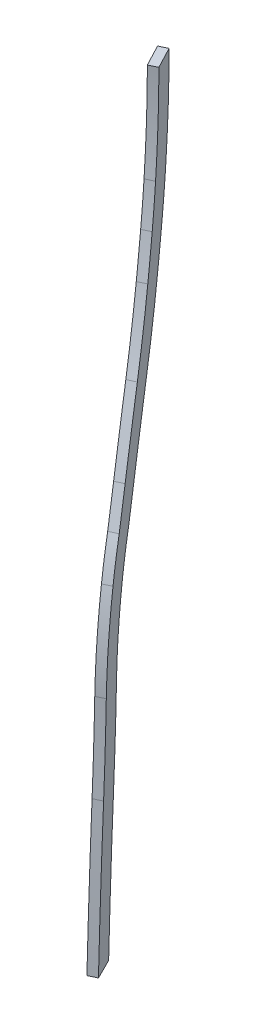
ISO-10303-21;
HEADER;
FILE_DESCRIPTION(('STEP AP214'),'2;1');
FILE_NAME('part.step','',(''),(''),'','','');
FILE_SCHEMA(('AUTOMOTIVE_DESIGN { 1 0 10303 214 1 1 1 1 }'));
ENDSEC;
DATA;
#1=APPLICATION_CONTEXT('core data for automotive mechanical design processes');
#2=APPLICATION_PROTOCOL_DEFINITION('international standard','automotive_design',2000,#1);
#3=PRODUCT_CONTEXT('',#1,'mechanical');
#4=PRODUCT('Part','Part','',(#3));
#5=PRODUCT_RELATED_PRODUCT_CATEGORY('part','',(#4));
#6=PRODUCT_DEFINITION_FORMATION('','',#4);
#7=PRODUCT_DEFINITION_CONTEXT('part definition',#1,'design');
#8=PRODUCT_DEFINITION('design','',#6,#7);
#9=PRODUCT_DEFINITION_SHAPE('','',#8);
#10=(LENGTH_UNIT() NAMED_UNIT(*) SI_UNIT(.MILLI.,.METRE.));
#11=(NAMED_UNIT(*) PLANE_ANGLE_UNIT() SI_UNIT($,.RADIAN.));
#12=(NAMED_UNIT(*) SI_UNIT($,.STERADIAN.) SOLID_ANGLE_UNIT());
#13=UNCERTAINTY_MEASURE_WITH_UNIT(LENGTH_MEASURE(1.E-05),#10,'distance_accuracy_value','');
#14=(GEOMETRIC_REPRESENTATION_CONTEXT(3) GLOBAL_UNCERTAINTY_ASSIGNED_CONTEXT((#13)) GLOBAL_UNIT_ASSIGNED_CONTEXT((#10,
#11,#12)) REPRESENTATION_CONTEXT('',''));
#15=CARTESIAN_POINT('',(0.,0.,0.));
#16=DIRECTION('',(0.,0.,1.));
#17=DIRECTION('',(1.,0.,0.));
#18=AXIS2_PLACEMENT_3D('',#15,#16,#17);
#19=CARTESIAN_POINT('',(-367.259245898407,666.87762557085,512.145917149951));
#20=DIRECTION('',(0.00922442193968946,0.999819165978723,-0.0166296536791849));
#21=DIRECTION('',(0.448846174599476,0.0107209315099118,0.893544723656839));
#22=AXIS2_PLACEMENT_3D('',#19,#20,#21);
#23=PLANE('',#22);
#24=DIRECTION('',(-0.448846174599474,-0.0107209315099118,-0.89354472365684));
#25=VECTOR('',#24,1.);
#26=CARTESIAN_POINT('',(-380.662667284647,667.113224420727,518.875908853125));
#27=LINE('',#26,#25);
#28=CARTESIAN_POINT('',(-380.662667284647,667.113224420725,518.875908853126));
#29=VERTEX_POINT('',#28);
#30=CARTESIAN_POINT('',(-398.616514268626,666.68438716033,483.134119906853));
#31=VERTEX_POINT('',#30);
#32=EDGE_CURVE('E169',#29,#31,#27,.T.);
#33=ORIENTED_EDGE('',*,*,#32,.T.);
#34=DIRECTION('',(-0.893561425749398,0.0157065899918101,0.448666113544954));
#35=VECTOR('',#34,1.);
#36=CARTESIAN_POINT('',(-385.213092882385,666.448788310454,476.404128203679));
#37=LINE('',#36,#35);
#38=CARTESIAN_POINT('',(-385.213092882385,666.448788310454,476.404128203679));
#39=VERTEX_POINT('',#38);
#40=EDGE_CURVE('E11',#39,#31,#37,.T.);
#41=ORIENTED_EDGE('',*,*,#40,.F.);
#42=DIRECTION('',(-0.448846174599474,-0.0107209315099118,-0.89354472365684));
#43=VECTOR('',#42,1.);
#44=CARTESIAN_POINT('',(-367.259245898407,666.87762557085,512.145917149951));
#45=LINE('',#44,#43);
#46=CARTESIAN_POINT('',(-367.259245898406,666.877625570848,512.145917149952));
#47=VERTEX_POINT('',#46);
#48=EDGE_CURVE('E190',#47,#39,#45,.T.);
#49=ORIENTED_EDGE('',*,*,#48,.F.);
#50=DIRECTION('',(-0.893561425749398,0.0157065899918101,0.448666113544954));
#51=VECTOR('',#50,1.);
#52=CARTESIAN_POINT('',(-367.259245898406,666.877625570848,512.145917149952));
#53=LINE('',#52,#51);
#54=EDGE_CURVE('E182',#47,#29,#53,.T.);
#55=ORIENTED_EDGE('',*,*,#54,.T.);
#56=EDGE_LOOP('',(#33,#41,#49,#55));
#57=FACE_BOUND('',#56,.T.);
#58=ADVANCED_FACE('F17',(#57),#23,.F.);
#59=CARTESIAN_POINT('',(-3526.45287345219,591.418592111018,-5777.04836957863));
#60=DIRECTION('',(-0.893561425749398,0.0157065899918101,0.448666113544954));
#61=DIRECTION('',(0.448846174599475,0.010720931509869,0.89354472365684));
#62=AXIS2_PLACEMENT_3D('',#59,#60,#61);
#63=CYLINDRICAL_SURFACE('',#62,6998.47733663514);
#64=CARTESIAN_POINT('',(-3539.85629483843,591.654190960895,-5770.31837787545));
#65=DIRECTION('',(-0.893561425749398,0.0157065899918101,0.448666113544954));
#66=DIRECTION('',(0.448846174599475,0.010720931509869,0.89354472365684));
#67=AXIS2_PLACEMENT_3D('',#64,#65,#66);
#68=CIRCLE('',#67,6998.47733663514);
#69=CARTESIAN_POINT('',(-398.399495897503,928.29078493591,474.408198635358));
#70=VERTEX_POINT('',#69);
#71=EDGE_CURVE('E165',#31,#70,#68,.T.);
#72=ORIENTED_EDGE('',*,*,#71,.T.);
#73=DIRECTION('',(-0.893561425749398,0.0157065899918101,0.448666113544954));
#74=VECTOR('',#73,1.);
#75=CARTESIAN_POINT('',(-384.996074511261,928.055186086033,467.678206932184));
#76=LINE('',#75,#74);
#77=CARTESIAN_POINT('',(-384.996074511261,928.055186086033,467.678206932184));
#78=VERTEX_POINT('',#77);
#79=EDGE_CURVE('E24',#78,#70,#76,.T.);
#80=ORIENTED_EDGE('',*,*,#79,.F.);
#81=CARTESIAN_POINT('',(-3526.45287345219,591.418592111018,-5777.04836957863));
#82=DIRECTION('',(-0.893561425749398,0.0157065899918101,0.448666113544954));
#83=DIRECTION('',(0.448846174599475,0.010720931509869,0.89354472365684));
#84=AXIS2_PLACEMENT_3D('',#81,#82,#83);
#85=CIRCLE('',#84,6998.47733663514);
#86=EDGE_CURVE('E178',#39,#78,#85,.T.);
#87=ORIENTED_EDGE('',*,*,#86,.F.);
#88=ORIENTED_EDGE('',*,*,#40,.T.);
#89=EDGE_LOOP('',(#72,#80,#87,#88));
#90=FACE_BOUND('',#89,.T.);
#91=ADVANCED_FACE('F177',(#90),#63,.F.);
#92=CARTESIAN_POINT('',(930.972336864513,1069.07355817785,3083.61833863724));
#93=DIRECTION('',(-0.893561425749398,0.0157065899918101,0.448666113544954));
#94=DIRECTION('',(0.448846174599475,0.010720931509869,0.89354472365684));
#95=AXIS2_PLACEMENT_3D('',#92,#93,#94);
#96=CYLINDRICAL_SURFACE('',#95,2931.68924234329);
#97=CARTESIAN_POINT('',(917.568915478271,1069.30915702773,3090.34833034041));
#98=DIRECTION('',(0.893561425749403,-0.0157065899918102,-0.448666113544943));
#99=DIRECTION('',(-0.448877183969173,-0.048101405174588,-0.892297892260279));
#100=AXIS2_PLACEMENT_3D('',#97,#98,#99);
#101=CIRCLE('',#100,2931.68924234329);
#102=CARTESIAN_POINT('',(-397.730767516883,1083.35071445715,470.311805356618));
#103=VERTEX_POINT('',#102);
#104=EDGE_CURVE('E171',#70,#103,#101,.T.);
#105=ORIENTED_EDGE('',*,*,#104,.T.);
#106=DIRECTION('',(-0.893561425749398,0.0157065899918101,0.448666113544954));
#107=VECTOR('',#106,1.);
#108=CARTESIAN_POINT('',(-384.327346130642,1083.11511560727,463.581813653444));
#109=LINE('',#108,#107);
#110=CARTESIAN_POINT('',(-384.327346130642,1083.11511560727,463.581813653444));
#111=VERTEX_POINT('',#110);
#112=EDGE_CURVE('E284',#111,#103,#109,.T.);
#113=ORIENTED_EDGE('',*,*,#112,.F.);
#114=CARTESIAN_POINT('',(930.972336864513,1069.07355817785,3083.61833863724));
#115=DIRECTION('',(0.893561425749403,-0.0157065899918102,-0.448666113544943));
#116=DIRECTION('',(-0.448877183969173,-0.048101405174588,-0.892297892260279));
#117=AXIS2_PLACEMENT_3D('',#114,#115,#116);
#118=CIRCLE('',#117,2931.68924234329);
#119=EDGE_CURVE('E189',#78,#111,#118,.T.);
#120=ORIENTED_EDGE('',*,*,#119,.F.);
#121=ORIENTED_EDGE('',*,*,#79,.T.);
#122=EDGE_LOOP('',(#105,#113,#120,#121));
#123=FACE_BOUND('',#122,.T.);
#124=ADVANCED_FACE('F288',(#123),#96,.T.);
#125=CARTESIAN_POINT('',(-656.514394695884,1086.02086410199,-78.6064177346578));
#126=DIRECTION('',(-0.893561425749398,0.0157065899918101,0.448666113544954));
#127=DIRECTION('',(0.448846174599475,0.010720931509869,0.89354472365684));
#128=AXIS2_PLACEMENT_3D('',#125,#126,#127);
#129=CYLINDRICAL_SURFACE('',#128,606.681391701386);
#130=CARTESIAN_POINT('',(-669.917816082124,1086.25646295186,-71.8764260314834));
#131=DIRECTION('',(-0.893561425749403,0.0157065899918104,0.448666113544942));
#132=DIRECTION('',(0.448649080536188,-0.00478957906813354,0.893695173124697));
#133=AXIS2_PLACEMENT_3D('',#130,#131,#132);
#134=CIRCLE('',#133,606.681391701386);
#135=CARTESIAN_POINT('',(-403.559584012147,1231.4283198228,453.519363081762));
#136=VERTEX_POINT('',#135);
#137=EDGE_CURVE('E297',#103,#136,#134,.T.);
#138=ORIENTED_EDGE('',*,*,#137,.T.);
#139=DIRECTION('',(-0.893561425749398,0.0157065899918101,0.448666113544954));
#140=VECTOR('',#139,1.);
#141=CARTESIAN_POINT('',(-390.156162625906,1231.19272097292,446.789371378588));
#142=LINE('',#141,#140);
#143=CARTESIAN_POINT('',(-390.156162625906,1231.19272097292,446.789371378588));
#144=VERTEX_POINT('',#143);
#145=EDGE_CURVE('E281',#144,#136,#142,.T.);
#146=ORIENTED_EDGE('',*,*,#145,.F.);
#147=CARTESIAN_POINT('',(-656.514394695884,1086.02086410199,-78.6064177346578));
#148=DIRECTION('',(-0.893561425749403,0.0157065899918104,0.448666113544942));
#149=DIRECTION('',(0.448649080536188,-0.00478957906813354,0.893695173124697));
#150=AXIS2_PLACEMENT_3D('',#147,#148,#149);
#151=CIRCLE('',#150,606.681391701386);
#152=EDGE_CURVE('E192',#111,#144,#151,.T.);
#153=ORIENTED_EDGE('',*,*,#152,.F.);
#154=ORIENTED_EDGE('',*,*,#112,.T.);
#155=EDGE_LOOP('',(#138,#146,#153,#154));
#156=FACE_BOUND('',#155,.T.);
#157=ADVANCED_FACE('F296',(#156),#129,.F.);
#158=CARTESIAN_POINT('',(-579.180408844646,1128.16980854424,73.9360819126184));
#159=DIRECTION('',(-0.893561425749398,0.0157065899918101,0.448666113544954));
#160=DIRECTION('',(0.448846174599475,0.010720931509869,0.89354472365684));
#161=AXIS2_PLACEMENT_3D('',#158,#159,#160);
#162=CYLINDRICAL_SURFACE('',#161,430.538571569894);
#163=CARTESIAN_POINT('',(-592.583830230887,1128.40540739412,80.6660736157928));
#164=DIRECTION('',(-0.893561425749404,0.0157065899918102,0.448666113544941));
#165=DIRECTION('',(0.43904137445686,0.239288461549506,0.866015995051074));
#166=AXIS2_PLACEMENT_3D('',#163,#164,#165);
#167=CIRCLE('',#166,430.538571569894);
#168=CARTESIAN_POINT('',(-411.658561122186,1292.40646354569,435.254796206568));
#169=VERTEX_POINT('',#168);
#170=EDGE_CURVE('E302',#136,#169,#167,.T.);
#171=ORIENTED_EDGE('',*,*,#170,.T.);
#172=DIRECTION('',(-0.893561425749398,0.0157065899918101,0.448666113544954));
#173=VECTOR('',#172,1.);
#174=CARTESIAN_POINT('',(-398.255139735945,1292.17086469581,428.524804503393));
#175=LINE('',#174,#173);
#176=CARTESIAN_POINT('',(-398.255139735945,1292.17086469581,428.524804503393));
#177=VERTEX_POINT('',#176);
#178=EDGE_CURVE('E278',#177,#169,#175,.T.);
#179=ORIENTED_EDGE('',*,*,#178,.F.);
#180=CARTESIAN_POINT('',(-579.180408844646,1128.16980854424,73.9360819126184));
#181=DIRECTION('',(-0.893561425749404,0.0157065899918102,0.448666113544941));
#182=DIRECTION('',(0.43904137445686,0.239288461549506,0.866015995051074));
#183=AXIS2_PLACEMENT_3D('',#180,#181,#182);
#184=CIRCLE('',#183,430.538571569894);
#185=EDGE_CURVE('E194',#144,#177,#184,.T.);
#186=ORIENTED_EDGE('',*,*,#185,.F.);
#187=ORIENTED_EDGE('',*,*,#145,.T.);
#188=EDGE_LOOP('',(#171,#179,#186,#187));
#189=FACE_BOUND('',#188,.T.);
#190=ADVANCED_FACE('F300',(#189),#162,.F.);
#191=CARTESIAN_POINT('',(1965.6974105357,3029.42801226526,5075.74544932382));
#192=DIRECTION('',(-0.893561425749398,0.0157065899918101,0.448666113544954));
#193=DIRECTION('',(0.448846174599475,0.010720931509869,0.89354472365684));
#194=AXIS2_PLACEMENT_3D('',#191,#192,#193);
#195=CYLINDRICAL_SURFACE('',#194,5495.72504573892);
#196=CARTESIAN_POINT('',(1952.29398914945,3029.66361111514,5082.47544102699));
#197=DIRECTION('',(0.8935614257494,-0.0157065899918134,-0.44866611354495));
#198=DIRECTION('',(-0.430159933052663,-0.315992223650541,-0.845642564319296));
#199=AXIS2_PLACEMENT_3D('',#196,#197,#198);
#200=CIRCLE('',#199,5495.72504573892);
#201=CARTESIAN_POINT('',(-420.142054222778,1356.45092392703,416.117085531441));
#202=VERTEX_POINT('',#201);
#203=EDGE_CURVE('E412',#169,#202,#200,.T.);
#204=ORIENTED_EDGE('',*,*,#203,.T.);
#205=DIRECTION('',(-0.893561425749398,0.0157065899918101,0.448666113544954));
#206=VECTOR('',#205,1.);
#207=CARTESIAN_POINT('',(-406.738632836537,1356.21532507715,409.387093828267));
#208=LINE('',#207,#206);
#209=CARTESIAN_POINT('',(-406.738632836537,1356.21532507715,409.387093828267));
#210=VERTEX_POINT('',#209);
#211=EDGE_CURVE('E275',#210,#202,#208,.T.);
#212=ORIENTED_EDGE('',*,*,#211,.F.);
#213=CARTESIAN_POINT('',(1965.6974105357,3029.42801226526,5075.74544932382));
#214=DIRECTION('',(0.8935614257494,-0.0157065899918134,-0.44866611354495));
#215=DIRECTION('',(-0.430159933052663,-0.315992223650541,-0.845642564319296));
#216=AXIS2_PLACEMENT_3D('',#213,#214,#215);
#217=CIRCLE('',#216,5495.72504573892);
#218=EDGE_CURVE('E196',#177,#210,#217,.T.);
#219=ORIENTED_EDGE('',*,*,#218,.F.);
#220=ORIENTED_EDGE('',*,*,#178,.T.);
#221=EDGE_LOOP('',(#204,#212,#219,#220));
#222=FACE_BOUND('',#221,.T.);
#223=ADVANCED_FACE('F306',(#222),#195,.T.);
#224=CARTESIAN_POINT('',(-2827.57420781658,-351.132196036755,-4352.16858399441));
#225=DIRECTION('',(-0.893561425749398,0.0157065899918101,0.448666113544954));
#226=DIRECTION('',(0.448846174599475,0.010720931509869,0.89354472365684));
#227=AXIS2_PLACEMENT_3D('',#224,#225,#226);
#228=CYLINDRICAL_SURFACE('',#227,5607.84209049685);
#229=CARTESIAN_POINT('',(-2840.97762920282,-350.896597186877,-4345.43859229123));
#230=DIRECTION('',(-0.893561425749418,0.0157065899918008,0.448666113544915));
#231=DIRECTION('',(0.431687543249913,0.304457132273249,0.849088758382069));
#232=AXIS2_PLACEMENT_3D('',#229,#230,#231);
#233=CIRCLE('',#232,5607.84209049685);
#234=CARTESIAN_POINT('',(-437.0535428079,1481.48164153858,378.059252425526));
#235=VERTEX_POINT('',#234);
#236=EDGE_CURVE('E314',#202,#235,#233,.T.);
#237=ORIENTED_EDGE('',*,*,#236,.T.);
#238=DIRECTION('',(-0.893561425749398,0.0157065899918101,0.448666113544954));
#239=VECTOR('',#238,1.);
#240=CARTESIAN_POINT('',(-423.650121421658,1481.2460426887,371.329260722351));
#241=LINE('',#240,#239);
#242=CARTESIAN_POINT('',(-423.650121421658,1481.2460426887,371.329260722351));
#243=VERTEX_POINT('',#242);
#244=EDGE_CURVE('E272',#243,#235,#241,.T.);
#245=ORIENTED_EDGE('',*,*,#244,.F.);
#246=CARTESIAN_POINT('',(-2827.57420781658,-351.132196036755,-4352.16858399441));
#247=DIRECTION('',(-0.893561425749418,0.0157065899918008,0.448666113544915));
#248=DIRECTION('',(0.431687543249913,0.304457132273249,0.849088758382069));
#249=AXIS2_PLACEMENT_3D('',#246,#247,#248);
#250=CIRCLE('',#249,5607.84209049685);
#251=EDGE_CURVE('E198',#210,#243,#250,.T.);
#252=ORIENTED_EDGE('',*,*,#251,.F.);
#253=ORIENTED_EDGE('',*,*,#211,.T.);
#254=EDGE_LOOP('',(#237,#245,#252,#253));
#255=FACE_BOUND('',#254,.T.);
#256=ADVANCED_FACE('F312',(#255),#228,.F.);
#257=CARTESIAN_POINT('',(62.4447301540991,1851.76923559026,1326.46257659553));
#258=DIRECTION('',(-0.893561425749398,0.0157065899918101,0.448666113544954));
#259=DIRECTION('',(0.448846174599475,0.010720931509869,0.89354472365684));
#260=AXIS2_PLACEMENT_3D('',#257,#258,#259);
#261=CYLINDRICAL_SURFACE('',#260,1133.95559538164);
#262=CARTESIAN_POINT('',(49.0413087678582,1852.00483444015,1333.19256829871));
#263=DIRECTION('',(0.893561425749402,-0.0157065899918112,-0.448666113544944));
#264=DIRECTION('',(-0.428671857659618,-0.326752823841228,-0.842302220442541));
#265=AXIS2_PLACEMENT_3D('',#262,#263,#264);
#266=CIRCLE('',#265,1133.95559538164);
#267=CARTESIAN_POINT('',(-451.551845244322,1611.08999787111,344.647259284302));
#268=VERTEX_POINT('',#267);
#269=EDGE_CURVE('E319',#235,#268,#266,.T.);
#270=ORIENTED_EDGE('',*,*,#269,.T.);
#271=DIRECTION('',(-0.893561425749398,0.0157065899918101,0.448666113544954));
#272=VECTOR('',#271,1.);
#273=CARTESIAN_POINT('',(-438.148423858081,1610.85439902123,337.917267581128));
#274=LINE('',#273,#272);
#275=CARTESIAN_POINT('',(-438.148423858081,1610.85439902123,337.917267581128));
#276=VERTEX_POINT('',#275);
#277=EDGE_CURVE('E269',#276,#268,#274,.T.);
#278=ORIENTED_EDGE('',*,*,#277,.F.);
#279=CARTESIAN_POINT('',(62.4447301540991,1851.76923559026,1326.46257659553));
#280=DIRECTION('',(0.893561425749402,-0.0157065899918112,-0.448666113544944));
#281=DIRECTION('',(-0.428671857659618,-0.326752823841228,-0.842302220442541));
#282=AXIS2_PLACEMENT_3D('',#279,#280,#281);
#283=CIRCLE('',#282,1133.95559538164);
#284=EDGE_CURVE('E200',#243,#276,#283,.T.);
#285=ORIENTED_EDGE('',*,*,#284,.F.);
#286=ORIENTED_EDGE('',*,*,#244,.T.);
#287=EDGE_LOOP('',(#270,#278,#285,#286));
#288=FACE_BOUND('',#287,.T.);
#289=ADVANCED_FACE('F317',(#288),#261,.T.);
#290=CARTESIAN_POINT('',(449.169142454486,2037.88374362917,2090.1458203573));
#291=DIRECTION('',(-0.893561425749398,0.0157065899918101,0.448666113544954));
#292=DIRECTION('',(0.448846174599475,0.010720931509869,0.89354472365684));
#293=AXIS2_PLACEMENT_3D('',#290,#291,#292);
#294=CYLINDRICAL_SURFACE('',#293,2009.97299131286);
#295=CARTESIAN_POINT('',(435.765721068246,2038.11934247904,2096.87581206047));
#296=DIRECTION('',(0.893561425749412,-0.0157065899918064,-0.448666113544924));
#297=DIRECTION('',(-0.441457457462148,-0.21245526504762,-0.871767212967201));
#298=AXIS2_PLACEMENT_3D('',#295,#296,#297);
#299=CIRCLE('',#298,2009.97299131286);
#300=CARTESIAN_POINT('',(-456.904774550663,1682.3871375515,331.49046873282));
#301=VERTEX_POINT('',#300);
#302=EDGE_CURVE('E408',#268,#301,#299,.T.);
#303=ORIENTED_EDGE('',*,*,#302,.T.);
#304=DIRECTION('',(-0.893561425749398,0.0157065899918101,0.448666113544954));
#305=VECTOR('',#304,1.);
#306=CARTESIAN_POINT('',(-443.501353164421,1682.15153870162,324.760477029645));
#307=LINE('',#306,#305);
#308=CARTESIAN_POINT('',(-443.501353164421,1682.15153870162,324.760477029645));
#309=VERTEX_POINT('',#308);
#310=EDGE_CURVE('E266',#309,#301,#307,.T.);
#311=ORIENTED_EDGE('',*,*,#310,.F.);
#312=CARTESIAN_POINT('',(449.169142454486,2037.88374362917,2090.1458203573));
#313=DIRECTION('',(0.893561425749412,-0.0157065899918064,-0.448666113544924));
#314=DIRECTION('',(-0.441457457462148,-0.21245526504762,-0.871767212967201));
#315=AXIS2_PLACEMENT_3D('',#312,#313,#314);
#316=CIRCLE('',#315,2009.97299131286);
#317=EDGE_CURVE('E202',#276,#309,#316,.T.);
#318=ORIENTED_EDGE('',*,*,#317,.F.);
#319=ORIENTED_EDGE('',*,*,#277,.T.);
#320=EDGE_LOOP('',(#303,#311,#318,#319));
#321=FACE_BOUND('',#320,.T.);
#322=ADVANCED_FACE('F323',(#321),#294,.T.);
#323=CARTESIAN_POINT('',(6.46857156249908,1861.46607218265,1214.64124933005));
#324=DIRECTION('',(-0.893561425749398,0.0157065899918101,0.448666113544954));
#325=DIRECTION('',(0.448846174599475,0.010720931509869,0.89354472365684));
#326=AXIS2_PLACEMENT_3D('',#323,#324,#325);
#327=CYLINDRICAL_SURFACE('',#326,1013.17048120552);
#328=CARTESIAN_POINT('',(-6.93484982374185,1861.70167103253,1221.37124103322));
#329=DIRECTION('',(0.893561425749409,-0.015706589991809,-0.44866611354493));
#330=DIRECTION('',(-0.444120642156415,-0.176983574637577,-0.878312967864576));
#331=AXIS2_PLACEMENT_3D('',#328,#329,#330);
#332=CIRCLE('',#331,1013.17048120552);
#333=CARTESIAN_POINT('',(-460.537475592368,1755.06654477592,321.711287645124));
#334=VERTEX_POINT('',#333);
#335=EDGE_CURVE('E331',#301,#334,#332,.T.);
#336=ORIENTED_EDGE('',*,*,#335,.T.);
#337=DIRECTION('',(-0.893561425749398,0.0157065899918101,0.448666113544954));
#338=VECTOR('',#337,1.);
#339=CARTESIAN_POINT('',(-447.134054206127,1754.83094592604,314.981295941949));
#340=LINE('',#339,#338);
#341=CARTESIAN_POINT('',(-447.134054206127,1754.83094592604,314.981295941949));
#342=VERTEX_POINT('',#341);
#343=EDGE_CURVE('E263',#342,#334,#340,.T.);
#344=ORIENTED_EDGE('',*,*,#343,.F.);
#345=CARTESIAN_POINT('',(6.46857156249908,1861.46607218265,1214.64124933005));
#346=DIRECTION('',(0.893561425749409,-0.015706589991809,-0.44866611354493));
#347=DIRECTION('',(-0.444120642156415,-0.176983574637577,-0.878312967864576));
#348=AXIS2_PLACEMENT_3D('',#345,#346,#347);
#349=CIRCLE('',#348,1013.17048120552);
#350=EDGE_CURVE('E204',#309,#342,#349,.T.);
#351=ORIENTED_EDGE('',*,*,#350,.F.);
#352=ORIENTED_EDGE('',*,*,#310,.T.);
#353=EDGE_LOOP('',(#336,#344,#351,#352));
#354=FACE_BOUND('',#353,.T.);
#355=ADVANCED_FACE('F329',(#354),#327,.T.);
#356=CARTESIAN_POINT('',(70.1760453634001,1876.44273705696,1340.99647669023));
#357=DIRECTION('',(-0.893561425749398,0.0157065899918101,0.448666113544954));
#358=DIRECTION('',(0.448846174599475,0.010720931509869,0.89354472365684));
#359=AXIS2_PLACEMENT_3D('',#356,#357,#358);
#360=CYLINDRICAL_SURFACE('',#359,1155.46800820474);
#361=CARTESIAN_POINT('',(56.7726239771592,1876.67833590684,1347.72646839341));
#362=DIRECTION('',(0.893561425749401,-0.0157065899918109,-0.448666113544946));
#363=DIRECTION('',(-0.4477061207201,-0.105248946978523,-0.887965026692871));
#364=AXIS2_PLACEMENT_3D('',#361,#362,#363);
#365=CIRCLE('',#364,1155.46800820474);
#366=CARTESIAN_POINT('',(-460.391936837352,1930.50731155918,315.85943412863));
#367=VERTEX_POINT('',#366);
#368=EDGE_CURVE('E336',#334,#367,#365,.T.);
#369=ORIENTED_EDGE('',*,*,#368,.T.);
#370=DIRECTION('',(-0.893561425749398,0.0157065899918101,0.448666113544954));
#371=VECTOR('',#370,1.);
#372=CARTESIAN_POINT('',(-446.988515451111,1930.27171270931,309.129442425455));
#373=LINE('',#372,#371);
#374=CARTESIAN_POINT('',(-446.988515451111,1930.27171270931,309.129442425455));
#375=VERTEX_POINT('',#374);
#376=EDGE_CURVE('E260',#375,#367,#373,.T.);
#377=ORIENTED_EDGE('',*,*,#376,.F.);
#378=CARTESIAN_POINT('',(70.1760453634001,1876.44273705696,1340.99647669023));
#379=DIRECTION('',(0.893561425749401,-0.0157065899918109,-0.448666113544946));
#380=DIRECTION('',(-0.4477061207201,-0.105248946978523,-0.887965026692871));
#381=AXIS2_PLACEMENT_3D('',#378,#379,#380);
#382=CIRCLE('',#381,1155.46800820474);
#383=EDGE_CURVE('E206',#342,#375,#382,.T.);
#384=ORIENTED_EDGE('',*,*,#383,.F.);
#385=ORIENTED_EDGE('',*,*,#343,.T.);
#386=EDGE_LOOP('',(#369,#377,#384,#385));
#387=FACE_BOUND('',#386,.T.);
#388=ADVANCED_FACE('F334',(#387),#360,.T.);
#389=CARTESIAN_POINT('',(-446.988515451111,1930.27171270931,309.129442425454));
#390=DIRECTION('',(-0.0349281411936377,-0.998790778879593,-0.0345977597230449));
#391=DIRECTION('',(-0.447580164177839,0.046586296868558,-0.893029514393905));
#392=AXIS2_PLACEMENT_3D('',#389,#390,#391);
#393=PLANE('',#392);
#394=DIRECTION('',(0.447580164177833,-0.0465862968685579,0.893029514393908));
#395=VECTOR('',#394,1.);
#396=CARTESIAN_POINT('',(-460.391936837352,1930.50731155918,315.859434128629));
#397=LINE('',#396,#395);
#398=CARTESIAN_POINT('',(-442.488730270238,1928.64385968444,351.580614704385));
#399=VERTEX_POINT('',#398);
#400=EDGE_CURVE('E404',#367,#399,#397,.T.);
#401=ORIENTED_EDGE('',*,*,#400,.T.);
#402=DIRECTION('',(-0.893561425749398,0.0157065899918101,0.448666113544954));
#403=VECTOR('',#402,1.);
#404=CARTESIAN_POINT('',(-429.085308883998,1928.40826083457,344.850623001211));
#405=LINE('',#404,#403);
#406=CARTESIAN_POINT('',(-429.085308883998,1928.40826083457,344.850623001211));
#407=VERTEX_POINT('',#406);
#408=EDGE_CURVE('E257',#407,#399,#405,.T.);
#409=ORIENTED_EDGE('',*,*,#408,.F.);
#410=DIRECTION('',(0.447580164177833,-0.0465862968685579,0.893029514393908));
#411=VECTOR('',#410,1.);
#412=CARTESIAN_POINT('',(-446.988515451111,1930.27171270931,309.129442425454));
#413=LINE('',#412,#411);
#414=EDGE_CURVE('E208',#375,#407,#413,.T.);
#415=ORIENTED_EDGE('',*,*,#414,.F.);
#416=ORIENTED_EDGE('',*,*,#376,.T.);
#417=EDGE_LOOP('',(#401,#409,#415,#416));
#418=FACE_BOUND('',#417,.T.);
#419=ADVANCED_FACE('F340',(#418),#393,.F.);
#420=CARTESIAN_POINT('',(70.1760453634001,1876.44273705696,1340.99647669023));
#421=DIRECTION('',(-0.893561425749398,0.0157065899918101,0.448666113544954));
#422=DIRECTION('',(0.448846174599475,0.010720931509869,0.89354472365684));
#423=AXIS2_PLACEMENT_3D('',#420,#421,#422);
#424=CYLINDRICAL_SURFACE('',#423,1115.46800820474);
#425=CARTESIAN_POINT('',(56.7726239771592,1876.67833590684,1347.72646839341));
#426=DIRECTION('',(-0.893561425749401,0.0157065899918109,0.448666113544946));
#427=DIRECTION('',(-0.447706120720101,-0.105248946978523,-0.887965026692871));
#428=AXIS2_PLACEMENT_3D('',#425,#426,#427);
#429=CIRCLE('',#428,1115.46800820474);
#430=CARTESIAN_POINT('',(-442.629230763563,1759.27650265506,357.229888712839));
#431=VERTEX_POINT('',#430);
#432=EDGE_CURVE('E348',#399,#431,#429,.T.);
#433=ORIENTED_EDGE('',*,*,#432,.T.);
#434=DIRECTION('',(-0.893561425749398,0.0157065899918101,0.448666113544954));
#435=VECTOR('',#434,1.);
#436=CARTESIAN_POINT('',(-429.225809377323,1759.04090380518,350.499897009664));
#437=LINE('',#436,#435);
#438=CARTESIAN_POINT('',(-429.225809377323,1759.04090380518,350.499897009664));
#439=VERTEX_POINT('',#438);
#440=EDGE_CURVE('E254',#439,#431,#437,.T.);
#441=ORIENTED_EDGE('',*,*,#440,.F.);
#442=CARTESIAN_POINT('',(70.1760453634001,1876.44273705696,1340.99647669023));
#443=DIRECTION('',(-0.893561425749401,0.0157065899918109,0.448666113544946));
#444=DIRECTION('',(-0.447706120720101,-0.105248946978523,-0.887965026692871));
#445=AXIS2_PLACEMENT_3D('',#442,#443,#444);
#446=CIRCLE('',#445,1115.46800820474);
#447=EDGE_CURVE('E210',#407,#439,#446,.T.);
#448=ORIENTED_EDGE('',*,*,#447,.F.);
#449=ORIENTED_EDGE('',*,*,#408,.T.);
#450=EDGE_LOOP('',(#433,#441,#448,#449));
#451=FACE_BOUND('',#450,.T.);
#452=ADVANCED_FACE('F346',(#451),#424,.F.);
#453=CARTESIAN_POINT('',(6.46857156249908,1861.46607218265,1214.64124933005));
#454=DIRECTION('',(-0.893561425749398,0.0157065899918101,0.448666113544954));
#455=DIRECTION('',(0.448846174599475,0.010720931509869,0.89354472365684));
#456=AXIS2_PLACEMENT_3D('',#453,#454,#455);
#457=CYLINDRICAL_SURFACE('',#456,973.170481205524);
#458=CARTESIAN_POINT('',(-6.93484982374185,1861.70167103253,1221.37124103322));
#459=DIRECTION('',(-0.89356142574941,0.015706589991809,0.44866611354493));
#460=DIRECTION('',(-0.444120642156415,-0.176983574637577,-0.878312967864576));
#461=AXIS2_PLACEMENT_3D('',#458,#459,#460);
#462=CIRCLE('',#461,973.170481205524);
#463=CARTESIAN_POINT('',(-439.139948864406,1689.46648053701,366.622987447403));
#464=VERTEX_POINT('',#463);
#465=EDGE_CURVE('E353',#431,#464,#462,.T.);
#466=ORIENTED_EDGE('',*,*,#465,.T.);
#467=DIRECTION('',(-0.893561425749398,0.0157065899918101,0.448666113544954));
#468=VECTOR('',#467,1.);
#469=CARTESIAN_POINT('',(-425.736527478165,1689.23088168713,359.892995744229));
#470=LINE('',#469,#468);
#471=CARTESIAN_POINT('',(-425.736527478165,1689.23088168713,359.892995744229));
#472=VERTEX_POINT('',#471);
#473=EDGE_CURVE('E251',#472,#464,#470,.T.);
#474=ORIENTED_EDGE('',*,*,#473,.F.);
#475=CARTESIAN_POINT('',(6.46857156249908,1861.46607218265,1214.64124933005));
#476=DIRECTION('',(-0.89356142574941,0.015706589991809,0.44866611354493));
#477=DIRECTION('',(-0.444120642156415,-0.176983574637577,-0.878312967864576));
#478=AXIS2_PLACEMENT_3D('',#475,#476,#477);
#479=CIRCLE('',#478,973.170481205524);
#480=EDGE_CURVE('E212',#439,#472,#479,.T.);
#481=ORIENTED_EDGE('',*,*,#480,.F.);
#482=ORIENTED_EDGE('',*,*,#440,.T.);
#483=EDGE_LOOP('',(#466,#474,#481,#482));
#484=FACE_BOUND('',#483,.T.);
#485=ADVANCED_FACE('F351',(#484),#457,.F.);
#486=CARTESIAN_POINT('',(449.169142454486,2037.88374362917,2090.1458203573));
#487=DIRECTION('',(-0.893561425749398,0.0157065899918101,0.448666113544954));
#488=DIRECTION('',(0.448846174599475,0.010720931509869,0.89354472365684));
#489=AXIS2_PLACEMENT_3D('',#486,#487,#488);
#490=CYLINDRICAL_SURFACE('',#489,1969.97299131286);
#491=CARTESIAN_POINT('',(435.765721068246,2038.11934247904,2096.87581206047));
#492=DIRECTION('',(-0.893561425749413,0.0157065899918063,0.448666113544924));
#493=DIRECTION('',(-0.441457457462148,-0.21245526504762,-0.871767212967201));
#494=AXIS2_PLACEMENT_3D('',#491,#492,#493);
#495=CIRCLE('',#494,1969.97299131286);
#496=CARTESIAN_POINT('',(-433.893546945836,1619.58820847301,379.51794780299));
#497=VERTEX_POINT('',#496);
#498=EDGE_CURVE('E400',#464,#497,#495,.T.);
#499=ORIENTED_EDGE('',*,*,#498,.T.);
#500=DIRECTION('',(-0.893561425749398,0.0157065899918101,0.448666113544954));
#501=VECTOR('',#500,1.);
#502=CARTESIAN_POINT('',(-420.490125559595,1619.35260962314,372.787956099815));
#503=LINE('',#502,#501);
#504=CARTESIAN_POINT('',(-420.490125559595,1619.35260962314,372.787956099815));
#505=VERTEX_POINT('',#504);
#506=EDGE_CURVE('E248',#505,#497,#503,.T.);
#507=ORIENTED_EDGE('',*,*,#506,.F.);
#508=CARTESIAN_POINT('',(449.169142454486,2037.88374362917,2090.1458203573));
#509=DIRECTION('',(-0.893561425749413,0.0157065899918063,0.448666113544924));
#510=DIRECTION('',(-0.441457457462148,-0.21245526504762,-0.871767212967201));
#511=AXIS2_PLACEMENT_3D('',#508,#509,#510);
#512=CIRCLE('',#511,1969.97299131286);
#513=EDGE_CURVE('E214',#472,#505,#512,.T.);
#514=ORIENTED_EDGE('',*,*,#513,.F.);
#515=ORIENTED_EDGE('',*,*,#473,.T.);
#516=EDGE_LOOP('',(#499,#507,#514,#515));
#517=FACE_BOUND('',#516,.T.);
#518=ADVANCED_FACE('F357',(#517),#490,.F.);
#519=CARTESIAN_POINT('',(62.4447301540991,1851.76923559026,1326.46257659553));
#520=DIRECTION('',(-0.893561425749398,0.0157065899918101,0.448666113544954));
#521=DIRECTION('',(0.448846174599475,0.010720931509869,0.89354472365684));
#522=AXIS2_PLACEMENT_3D('',#519,#520,#521);
#523=CYLINDRICAL_SURFACE('',#522,1093.95559538164);
#524=CARTESIAN_POINT('',(49.0413087678582,1852.00483444015,1333.19256829871));
#525=DIRECTION('',(-0.893561425749402,0.0157065899918113,0.448666113544945));
#526=DIRECTION('',(-0.428671857659619,-0.326752823841228,-0.842302220442541));
#527=AXIS2_PLACEMENT_3D('',#524,#525,#526);
#528=CIRCLE('',#527,1093.95559538164);
#529=CARTESIAN_POINT('',(-419.906668501524,1494.55175449228,411.751341243209));
#530=VERTEX_POINT('',#529);
#531=EDGE_CURVE('E365',#497,#530,#528,.T.);
#532=ORIENTED_EDGE('',*,*,#531,.T.);
#533=DIRECTION('',(-0.893561425749398,0.0157065899918101,0.448666113544954));
#534=VECTOR('',#533,1.);
#535=CARTESIAN_POINT('',(-406.503247115283,1494.3161556424,405.021349540034));
#536=LINE('',#535,#534);
#537=CARTESIAN_POINT('',(-406.503247115283,1494.3161556424,405.021349540034));
#538=VERTEX_POINT('',#537);
#539=EDGE_CURVE('E245',#538,#530,#536,.T.);
#540=ORIENTED_EDGE('',*,*,#539,.F.);
#541=CARTESIAN_POINT('',(62.4447301540991,1851.76923559026,1326.46257659553));
#542=DIRECTION('',(-0.893561425749402,0.0157065899918113,0.448666113544945));
#543=DIRECTION('',(-0.428671857659619,-0.326752823841228,-0.842302220442541));
#544=AXIS2_PLACEMENT_3D('',#541,#542,#543);
#545=CIRCLE('',#544,1093.95559538164);
#546=EDGE_CURVE('E216',#505,#538,#545,.T.);
#547=ORIENTED_EDGE('',*,*,#546,.F.);
#548=ORIENTED_EDGE('',*,*,#506,.T.);
#549=EDGE_LOOP('',(#532,#540,#547,#548));
#550=FACE_BOUND('',#549,.T.);
#551=ADVANCED_FACE('F363',(#550),#523,.F.);
#552=CARTESIAN_POINT('',(-2827.57420781658,-351.132196036755,-4352.16858399441));
#553=DIRECTION('',(-0.893561425749398,0.0157065899918101,0.448666113544954));
#554=DIRECTION('',(0.448846174599475,0.010720931509869,0.89354472365684));
#555=AXIS2_PLACEMENT_3D('',#552,#553,#554);
#556=CYLINDRICAL_SURFACE('',#555,5647.84209049685);
#557=CARTESIAN_POINT('',(-2840.97762920282,-350.896597186877,-4345.43859229123));
#558=DIRECTION('',(0.893561425749417,-0.0157065899918008,-0.448666113544914));
#559=DIRECTION('',(0.431687543249912,0.304457132273249,0.849088758382069));
#560=AXIS2_PLACEMENT_3D('',#557,#558,#559);
#561=CIRCLE('',#560,5647.84209049685);
#562=CARTESIAN_POINT('',(-402.87455249278,1368.62920921795,450.080635866726));
#563=VERTEX_POINT('',#562);
#564=EDGE_CURVE('E370',#530,#563,#561,.T.);
#565=ORIENTED_EDGE('',*,*,#564,.T.);
#566=DIRECTION('',(-0.893561425749398,0.0157065899918101,0.448666113544954));
#567=VECTOR('',#566,1.);
#568=CARTESIAN_POINT('',(-389.471131106539,1368.39361036807,443.350644163552));
#569=LINE('',#568,#567);
#570=CARTESIAN_POINT('',(-389.471131106539,1368.39361036807,443.350644163552));
#571=VERTEX_POINT('',#570);
#572=EDGE_CURVE('E242',#571,#563,#569,.T.);
#573=ORIENTED_EDGE('',*,*,#572,.F.);
#574=CARTESIAN_POINT('',(-2827.57420781658,-351.132196036755,-4352.16858399441));
#575=DIRECTION('',(0.893561425749417,-0.0157065899918008,-0.448666113544914));
#576=DIRECTION('',(0.431687543249912,0.304457132273249,0.849088758382069));
#577=AXIS2_PLACEMENT_3D('',#574,#575,#576);
#578=CIRCLE('',#577,5647.84209049685);
#579=EDGE_CURVE('E218',#538,#571,#578,.T.);
#580=ORIENTED_EDGE('',*,*,#579,.F.);
#581=ORIENTED_EDGE('',*,*,#539,.T.);
#582=EDGE_LOOP('',(#565,#573,#580,#581));
#583=FACE_BOUND('',#582,.T.);
#584=ADVANCED_FACE('F368',(#583),#556,.T.);
#585=CARTESIAN_POINT('',(1965.6974105357,3029.42801226526,5075.74544932382));
#586=DIRECTION('',(-0.893561425749398,0.0157065899918101,0.448666113544954));
#587=DIRECTION('',(0.448846174599475,0.010720931509869,0.89354472365684));
#588=AXIS2_PLACEMENT_3D('',#585,#586,#587);
#589=CYLINDRICAL_SURFACE('',#588,5455.72504573892);
#590=CARTESIAN_POINT('',(1952.29398914945,3029.66361111514,5082.47544102699));
#591=DIRECTION('',(-0.8935614257494,0.0157065899918134,0.44866611354495));
#592=DIRECTION('',(-0.430159933052663,-0.315992223650541,-0.845642564319296));
#593=AXIS2_PLACEMENT_3D('',#590,#591,#592);
#594=CIRCLE('',#593,5455.72504573892);
#595=CARTESIAN_POINT('',(-394.626367615676,1306.33225140475,468.688532386419));
#596=VERTEX_POINT('',#595);
#597=EDGE_CURVE('E396',#563,#596,#594,.T.);
#598=ORIENTED_EDGE('',*,*,#597,.T.);
#599=DIRECTION('',(-0.893561425749398,0.0157065899918101,0.448666113544954));
#600=VECTOR('',#599,1.);
#601=CARTESIAN_POINT('',(-381.222946229436,1306.09665255487,461.958540683245));
#602=LINE('',#601,#600);
#603=CARTESIAN_POINT('',(-381.222946229436,1306.09665255487,461.958540683245));
#604=VERTEX_POINT('',#603);
#605=EDGE_CURVE('E239',#604,#596,#602,.T.);
#606=ORIENTED_EDGE('',*,*,#605,.F.);
#607=CARTESIAN_POINT('',(1965.6974105357,3029.42801226526,5075.74544932382));
#608=DIRECTION('',(-0.8935614257494,0.0157065899918134,0.44866611354495));
#609=DIRECTION('',(-0.430159933052663,-0.315992223650541,-0.845642564319296));
#610=AXIS2_PLACEMENT_3D('',#607,#608,#609);
#611=CIRCLE('',#610,5455.72504573892);
#612=EDGE_CURVE('E220',#571,#604,#611,.T.);
#613=ORIENTED_EDGE('',*,*,#612,.F.);
#614=ORIENTED_EDGE('',*,*,#572,.T.);
#615=EDGE_LOOP('',(#598,#606,#613,#614));
#616=FACE_BOUND('',#615,.T.);
#617=ADVANCED_FACE('F374',(#616),#589,.F.);
#618=CARTESIAN_POINT('',(-579.180408844646,1128.16980854424,73.9360819126184));
#619=DIRECTION('',(-0.893561425749398,0.0157065899918101,0.448666113544954));
#620=DIRECTION('',(0.448846174599475,0.010720931509869,0.89354472365684));
#621=AXIS2_PLACEMENT_3D('',#618,#619,#620);
#622=CYLINDRICAL_SURFACE('',#621,470.538571569894);
#623=CARTESIAN_POINT('',(-592.583830230887,1128.40540739412,80.6660736157928));
#624=DIRECTION('',(0.893561425749404,-0.0157065899918102,-0.448666113544941));
#625=DIRECTION('',(0.43904137445686,0.239288461549506,0.866015995051074));
#626=AXIS2_PLACEMENT_3D('',#623,#624,#625);
#627=CIRCLE('',#626,470.538571569894);
#628=CARTESIAN_POINT('',(-385.997929033873,1240.99985828478,488.160002883805));
#629=VERTEX_POINT('',#628);
#630=EDGE_CURVE('E382',#596,#629,#627,.T.);
#631=ORIENTED_EDGE('',*,*,#630,.T.);
#632=DIRECTION('',(-0.893561425749398,0.0157065899918101,0.448666113544954));
#633=VECTOR('',#632,1.);
#634=CARTESIAN_POINT('',(-372.594507647632,1240.7642594349,481.430011180631));
#635=LINE('',#634,#633);
#636=CARTESIAN_POINT('',(-372.594507647632,1240.7642594349,481.430011180631));
#637=VERTEX_POINT('',#636);
#638=EDGE_CURVE('E236',#637,#629,#635,.T.);
#639=ORIENTED_EDGE('',*,*,#638,.F.);
#640=CARTESIAN_POINT('',(-579.180408844646,1128.16980854424,73.9360819126184));
#641=DIRECTION('',(0.893561425749404,-0.0157065899918102,-0.448666113544941));
#642=DIRECTION('',(0.43904137445686,0.239288461549506,0.866015995051074));
#643=AXIS2_PLACEMENT_3D('',#640,#641,#642);
#644=CIRCLE('',#643,470.538571569894);
#645=EDGE_CURVE('E222',#604,#637,#644,.T.);
#646=ORIENTED_EDGE('',*,*,#645,.F.);
#647=ORIENTED_EDGE('',*,*,#605,.T.);
#648=EDGE_LOOP('',(#631,#639,#646,#647));
#649=FACE_BOUND('',#648,.T.);
#650=ADVANCED_FACE('F380',(#649),#622,.T.);
#651=CARTESIAN_POINT('',(-656.514394695884,1086.02086410199,-78.6064177346578));
#652=DIRECTION('',(-0.893561425749398,0.0157065899918101,0.448666113544954));
#653=DIRECTION('',(0.448846174599475,0.010720931509869,0.89354472365684));
#654=AXIS2_PLACEMENT_3D('',#651,#652,#653);
#655=CYLINDRICAL_SURFACE('',#654,646.681391701386);
#656=CARTESIAN_POINT('',(-669.917816082124,1086.25646295186,-71.8764260314834));
#657=DIRECTION('',(0.893561425749403,-0.0157065899918104,-0.448666113544942));
#658=DIRECTION('',(0.448649080536188,-0.00478957906813359,0.893695173124697));
#659=AXIS2_PLACEMENT_3D('',#656,#657,#658);
#660=CIRCLE('',#659,646.681391701386);
#661=CARTESIAN_POINT('',(-379.784804295435,1083.15913129442,506.059612281607));
#662=VERTEX_POINT('',#661);
#663=EDGE_CURVE('E386',#629,#662,#660,.T.);
#664=ORIENTED_EDGE('',*,*,#663,.T.);
#665=DIRECTION('',(-0.893561425749398,0.0157065899918101,0.448666113544954));
#666=VECTOR('',#665,1.);
#667=CARTESIAN_POINT('',(-366.381382909194,1082.92353244454,499.329620578432));
#668=LINE('',#667,#666);
#669=CARTESIAN_POINT('',(-366.381382909194,1082.92353244454,499.329620578432));
#670=VERTEX_POINT('',#669);
#671=EDGE_CURVE('E233',#670,#662,#668,.T.);
#672=ORIENTED_EDGE('',*,*,#671,.F.);
#673=CARTESIAN_POINT('',(-656.514394695884,1086.02086410199,-78.6064177346578));
#674=DIRECTION('',(0.893561425749403,-0.0157065899918104,-0.448666113544942));
#675=DIRECTION('',(0.448649080536188,-0.00478957906813359,0.893695173124697));
#676=AXIS2_PLACEMENT_3D('',#673,#674,#675);
#677=CIRCLE('',#676,646.681391701386);
#678=EDGE_CURVE('E224',#637,#670,#677,.T.);
#679=ORIENTED_EDGE('',*,*,#678,.F.);
#680=ORIENTED_EDGE('',*,*,#638,.T.);
#681=EDGE_LOOP('',(#664,#672,#679,#680));
#682=FACE_BOUND('',#681,.T.);
#683=ADVANCED_FACE('F385',(#682),#655,.T.);
#684=CARTESIAN_POINT('',(930.972336864513,1069.07355817785,3083.61833863724));
#685=DIRECTION('',(-0.893561425749398,0.0157065899918101,0.448666113544954));
#686=DIRECTION('',(0.448846174599475,0.010720931509869,0.89354472365684));
#687=AXIS2_PLACEMENT_3D('',#684,#685,#686);
#688=CYLINDRICAL_SURFACE('',#687,2891.68924234329);
#689=CARTESIAN_POINT('',(917.568915478271,1069.30915702773,3090.34833034041));
#690=DIRECTION('',(-0.893561425749404,0.0157065899918103,0.448666113544943));
#691=DIRECTION('',(-0.448877183969173,-0.0481014051745879,-0.892297892260279));
#692=AXIS2_PLACEMENT_3D('',#689,#690,#691);
#693=CIRCLE('',#692,2891.68924234329);
#694=CARTESIAN_POINT('',(-380.444408538734,930.214841142779,510.100114325776));
#695=VERTEX_POINT('',#694);
#696=EDGE_CURVE('E390',#662,#695,#693,.T.);
#697=ORIENTED_EDGE('',*,*,#696,.T.);
#698=DIRECTION('',(-0.893561425749398,0.0157065899918101,0.448666113544954));
#699=VECTOR('',#698,1.);
#700=CARTESIAN_POINT('',(-367.040987152493,929.979242292902,503.370122622602));
#701=LINE('',#700,#699);
#702=CARTESIAN_POINT('',(-367.040987152493,929.979242292902,503.370122622602));
#703=VERTEX_POINT('',#702);
#704=EDGE_CURVE('E230',#703,#695,#701,.T.);
#705=ORIENTED_EDGE('',*,*,#704,.F.);
#706=CARTESIAN_POINT('',(930.972336864513,1069.07355817785,3083.61833863724));
#707=DIRECTION('',(-0.893561425749404,0.0157065899918103,0.448666113544943));
#708=DIRECTION('',(-0.448877183969173,-0.0481014051745879,-0.892297892260279));
#709=AXIS2_PLACEMENT_3D('',#706,#707,#708);
#710=CIRCLE('',#709,2891.68924234329);
#711=EDGE_CURVE('E36',#670,#703,#710,.T.);
#712=ORIENTED_EDGE('',*,*,#711,.F.);
#713=ORIENTED_EDGE('',*,*,#671,.T.);
#714=EDGE_LOOP('',(#697,#705,#712,#713));
#715=FACE_BOUND('',#714,.T.);
#716=ADVANCED_FACE('F389',(#715),#688,.F.);
#717=CARTESIAN_POINT('',(-3526.45287345219,591.418592111018,-5777.04836957863));
#718=DIRECTION('',(-0.893561425749398,0.0157065899918101,0.448666113544954));
#719=DIRECTION('',(0.448846174599475,0.010720931509869,0.89354472365684));
#720=AXIS2_PLACEMENT_3D('',#717,#718,#719);
#721=CYLINDRICAL_SURFACE('',#720,7038.47733663514);
#722=CARTESIAN_POINT('',(-3539.85629483843,591.654190960895,-5770.31837787545));
#723=DIRECTION('',(0.893561425749398,-0.0157065899918101,-0.448666113544954));
#724=DIRECTION('',(0.448846174599475,0.010720931509869,0.89354472365684));
#725=AXIS2_PLACEMENT_3D('',#722,#723,#724);
#726=CIRCLE('',#725,7038.47733663514);
#727=EDGE_CURVE('E186',#695,#29,#726,.T.);
#728=ORIENTED_EDGE('',*,*,#727,.T.);
#729=ORIENTED_EDGE('',*,*,#54,.F.);
#730=CARTESIAN_POINT('',(-3526.45287345219,591.418592111018,-5777.04836957863));
#731=DIRECTION('',(0.893561425749398,-0.0157065899918101,-0.448666113544954));
#732=DIRECTION('',(0.448846174599475,0.010720931509869,0.89354472365684));
#733=AXIS2_PLACEMENT_3D('',#730,#731,#732);
#734=CIRCLE('',#733,7038.47733663514);
#735=EDGE_CURVE('E31',#703,#47,#734,.T.);
#736=ORIENTED_EDGE('',*,*,#735,.F.);
#737=ORIENTED_EDGE('',*,*,#704,.T.);
#738=EDGE_LOOP('',(#728,#729,#736,#737));
#739=FACE_BOUND('',#738,.T.);
#740=ADVANCED_FACE('F392',(#739),#721,.T.);
#741=CARTESIAN_POINT('',(-3526.45287345219,591.418592111018,-5777.04836957863));
#742=DIRECTION('',(-0.893561425749398,0.0157065899918101,0.448666113544954));
#743=DIRECTION('',(0.448846174599475,0.010720931509869,0.89354472365684));
#744=AXIS2_PLACEMENT_3D('',#741,#742,#743);
#745=PLANE('',#744);
#746=ORIENTED_EDGE('',*,*,#48,.T.);
#747=ORIENTED_EDGE('',*,*,#86,.T.);
#748=ORIENTED_EDGE('',*,*,#119,.T.);
#749=ORIENTED_EDGE('',*,*,#152,.T.);
#750=ORIENTED_EDGE('',*,*,#185,.T.);
#751=ORIENTED_EDGE('',*,*,#218,.T.);
#752=ORIENTED_EDGE('',*,*,#251,.T.);
#753=ORIENTED_EDGE('',*,*,#284,.T.);
#754=ORIENTED_EDGE('',*,*,#317,.T.);
#755=ORIENTED_EDGE('',*,*,#350,.T.);
#756=ORIENTED_EDGE('',*,*,#383,.T.);
#757=ORIENTED_EDGE('',*,*,#414,.T.);
#758=ORIENTED_EDGE('',*,*,#447,.T.);
#759=ORIENTED_EDGE('',*,*,#480,.T.);
#760=ORIENTED_EDGE('',*,*,#513,.T.);
#761=ORIENTED_EDGE('',*,*,#546,.T.);
#762=ORIENTED_EDGE('',*,*,#579,.T.);
#763=ORIENTED_EDGE('',*,*,#612,.T.);
#764=ORIENTED_EDGE('',*,*,#645,.T.);
#765=ORIENTED_EDGE('',*,*,#678,.T.);
#766=ORIENTED_EDGE('',*,*,#711,.T.);
#767=ORIENTED_EDGE('',*,*,#735,.T.);
#768=EDGE_LOOP('',(#746,#747,#748,#749,#750,#751,#752,#753,#754,#755,#756,#757,#758,#759,#760,
#761,#762,#763,#764,#765,#766,#767));
#769=FACE_BOUND('',#768,.T.);
#770=ADVANCED_FACE('F291',(#769),#745,.F.);
#771=CARTESIAN_POINT('',(-3539.85629483843,591.654190960895,-5770.31837787545));
#772=DIRECTION('',(-0.893561425749398,0.0157065899918101,0.448666113544954));
#773=DIRECTION('',(0.448846174599475,0.010720931509869,0.89354472365684));
#774=AXIS2_PLACEMENT_3D('',#771,#772,#773);
#775=PLANE('',#774);
#776=ORIENTED_EDGE('',*,*,#32,.F.);
#777=ORIENTED_EDGE('',*,*,#727,.F.);
#778=ORIENTED_EDGE('',*,*,#696,.F.);
#779=ORIENTED_EDGE('',*,*,#663,.F.);
#780=ORIENTED_EDGE('',*,*,#630,.F.);
#781=ORIENTED_EDGE('',*,*,#597,.F.);
#782=ORIENTED_EDGE('',*,*,#564,.F.);
#783=ORIENTED_EDGE('',*,*,#531,.F.);
#784=ORIENTED_EDGE('',*,*,#498,.F.);
#785=ORIENTED_EDGE('',*,*,#465,.F.);
#786=ORIENTED_EDGE('',*,*,#432,.F.);
#787=ORIENTED_EDGE('',*,*,#400,.F.);
#788=ORIENTED_EDGE('',*,*,#368,.F.);
#789=ORIENTED_EDGE('',*,*,#335,.F.);
#790=ORIENTED_EDGE('',*,*,#302,.F.);
#791=ORIENTED_EDGE('',*,*,#269,.F.);
#792=ORIENTED_EDGE('',*,*,#236,.F.);
#793=ORIENTED_EDGE('',*,*,#203,.F.);
#794=ORIENTED_EDGE('',*,*,#170,.F.);
#795=ORIENTED_EDGE('',*,*,#137,.F.);
#796=ORIENTED_EDGE('',*,*,#104,.F.);
#797=ORIENTED_EDGE('',*,*,#71,.F.);
#798=EDGE_LOOP('',(#776,#777,#778,#779,#780,#781,#782,#783,#784,#785,#786,#787,#788,#789,#790,
#791,#792,#793,#794,#795,#796,#797));
#799=FACE_BOUND('',#798,.T.);
#800=ADVANCED_FACE('F166',(#799),#775,.T.);
#801=CLOSED_SHELL('',(#58,#91,#124,#157,#190,#223,#256,#289,#322,#355,#388,#419,#452,#485,#518,
#551,#584,#617,#650,#683,#716,#740,#770,#800));
#802=MANIFOLD_SOLID_BREP('B1',#801);
#803=ADVANCED_BREP_SHAPE_REPRESENTATION('',(#18,#802),#14);
#804=SHAPE_DEFINITION_REPRESENTATION(#9,#803);
ENDSEC;
END-ISO-10303-21;
